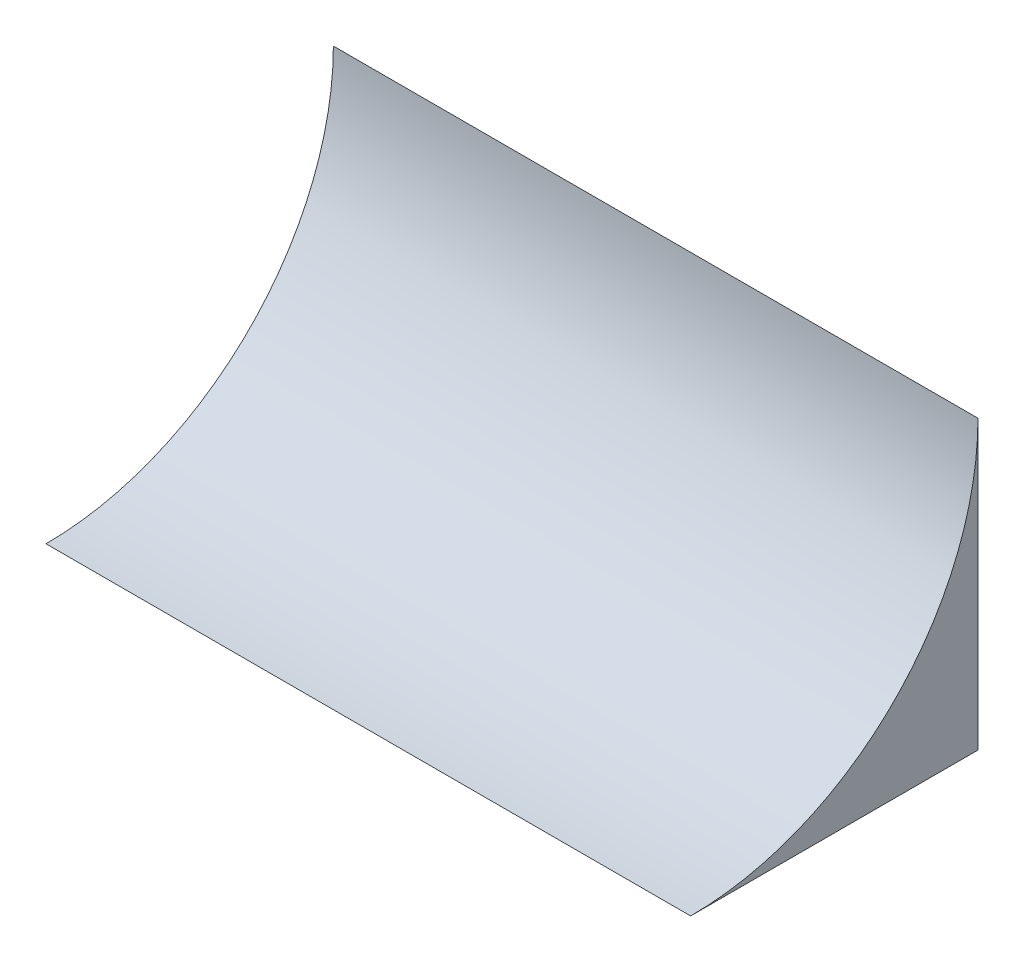
ISO-10303-21;
HEADER;
FILE_DESCRIPTION(('STEP AP214'),'2;1');
FILE_NAME('part.step','',(''),(''),'','','');
FILE_SCHEMA(('AUTOMOTIVE_DESIGN { 1 0 10303 214 1 1 1 1 }'));
ENDSEC;
DATA;
#1=APPLICATION_CONTEXT('core data for automotive mechanical design processes');
#2=APPLICATION_PROTOCOL_DEFINITION('international standard','automotive_design',2000,#1);
#3=PRODUCT_CONTEXT('',#1,'mechanical');
#4=PRODUCT('Part','Part','',(#3));
#5=PRODUCT_RELATED_PRODUCT_CATEGORY('part','',(#4));
#6=PRODUCT_DEFINITION_FORMATION('','',#4);
#7=PRODUCT_DEFINITION_CONTEXT('part definition',#1,'design');
#8=PRODUCT_DEFINITION('design','',#6,#7);
#9=PRODUCT_DEFINITION_SHAPE('','',#8);
#10=(LENGTH_UNIT() NAMED_UNIT(*) SI_UNIT(.MILLI.,.METRE.));
#11=(NAMED_UNIT(*) PLANE_ANGLE_UNIT() SI_UNIT($,.RADIAN.));
#12=(NAMED_UNIT(*) SI_UNIT($,.STERADIAN.) SOLID_ANGLE_UNIT());
#13=UNCERTAINTY_MEASURE_WITH_UNIT(LENGTH_MEASURE(1.E-05),#10,'distance_accuracy_value','');
#14=(GEOMETRIC_REPRESENTATION_CONTEXT(3) GLOBAL_UNCERTAINTY_ASSIGNED_CONTEXT((#13)) GLOBAL_UNIT_ASSIGNED_CONTEXT((#10,
#11,#12)) REPRESENTATION_CONTEXT('',''));
#15=CARTESIAN_POINT('',(0.,0.,0.));
#16=DIRECTION('',(0.,0.,1.));
#17=DIRECTION('',(1.,0.,0.));
#18=AXIS2_PLACEMENT_3D('',#15,#16,#17);
#19=CARTESIAN_POINT('',(100.,-22.29,-22.29));
#20=DIRECTION('',(0.,0.,1.));
#21=DIRECTION('',(1.,0.,0.));
#22=AXIS2_PLACEMENT_3D('',#19,#20,#21);
#23=PLANE('',#22);
#24=DIRECTION('',(0.,1.,0.));
#25=VECTOR('',#24,1.);
#26=CARTESIAN_POINT('',(0.,-22.29,-22.29));
#27=LINE('',#26,#25);
#28=CARTESIAN_POINT('',(0.,-22.29,-22.29));
#29=VERTEX_POINT('',#28);
#30=CARTESIAN_POINT('',(0.,22.29,-22.29));
#31=VERTEX_POINT('',#30);
#32=EDGE_CURVE('E79',#29,#31,#27,.T.);
#33=ORIENTED_EDGE('',*,*,#32,.T.);
#34=DIRECTION('',(-1.,0.,0.));
#35=VECTOR('',#34,1.);
#36=CARTESIAN_POINT('',(100.,22.29,-22.29));
#37=LINE('',#36,#35);
#38=CARTESIAN_POINT('',(100.,22.29,-22.29));
#39=VERTEX_POINT('',#38);
#40=EDGE_CURVE('E41',#39,#31,#37,.T.);
#41=ORIENTED_EDGE('',*,*,#40,.F.);
#42=DIRECTION('',(0.,1.,0.));
#43=VECTOR('',#42,1.);
#44=CARTESIAN_POINT('',(100.,-22.29,-22.29));
#45=LINE('',#44,#43);
#46=CARTESIAN_POINT('',(100.,-22.29,-22.29));
#47=VERTEX_POINT('',#46);
#48=EDGE_CURVE('E80',#47,#39,#45,.T.);
#49=ORIENTED_EDGE('',*,*,#48,.F.);
#50=DIRECTION('',(-1.,0.,0.));
#51=VECTOR('',#50,1.);
#52=CARTESIAN_POINT('',(100.,-22.29,-22.29));
#53=LINE('',#52,#51);
#54=EDGE_CURVE('E76',#47,#29,#53,.T.);
#55=ORIENTED_EDGE('',*,*,#54,.T.);
#56=EDGE_LOOP('',(#33,#41,#49,#55));
#57=FACE_BOUND('',#56,.T.);
#58=ADVANCED_FACE('F33',(#57),#23,.F.);
#59=CARTESIAN_POINT('',(100.,-22.29,22.29));
#60=DIRECTION('',(0.,1.,0.));
#61=DIRECTION('',(0.,0.,1.));
#62=AXIS2_PLACEMENT_3D('',#59,#60,#61);
#63=PLANE('',#62);
#64=DIRECTION('',(0.,0.,-1.));
#65=VECTOR('',#64,1.);
#66=CARTESIAN_POINT('',(0.,-22.29,22.29));
#67=LINE('',#66,#65);
#68=CARTESIAN_POINT('',(0.,-22.29,22.29));
#69=VERTEX_POINT('',#68);
#70=EDGE_CURVE('E74',#69,#29,#67,.T.);
#71=ORIENTED_EDGE('',*,*,#70,.T.);
#72=ORIENTED_EDGE('',*,*,#54,.F.);
#73=DIRECTION('',(0.,0.,-1.));
#74=VECTOR('',#73,1.);
#75=CARTESIAN_POINT('',(100.,-22.29,22.29));
#76=LINE('',#75,#74);
#77=CARTESIAN_POINT('',(100.,-22.29,22.29));
#78=VERTEX_POINT('',#77);
#79=EDGE_CURVE('E48',#78,#47,#76,.T.);
#80=ORIENTED_EDGE('',*,*,#79,.F.);
#81=DIRECTION('',(-1.,0.,0.));
#82=VECTOR('',#81,1.);
#83=CARTESIAN_POINT('',(100.,-22.29,22.29));
#84=LINE('',#83,#82);
#85=EDGE_CURVE('E63',#78,#69,#84,.T.);
#86=ORIENTED_EDGE('',*,*,#85,.T.);
#87=EDGE_LOOP('',(#71,#72,#80,#86));
#88=FACE_BOUND('',#87,.T.);
#89=ADVANCED_FACE('F73',(#88),#63,.F.);
#90=CARTESIAN_POINT('',(100.,0.,0.));
#91=DIRECTION('',(-1.,0.,0.));
#92=DIRECTION('',(0.,0.,1.));
#93=AXIS2_PLACEMENT_3D('',#90,#91,#92);
#94=PLANE('',#93);
#95=ORIENTED_EDGE('',*,*,#48,.T.);
#96=CARTESIAN_POINT('',(100.,22.29,22.29));
#97=DIRECTION('',(1.,0.,0.));
#98=DIRECTION('',(0.,0.,-1.));
#99=AXIS2_PLACEMENT_3D('',#96,#97,#98);
#100=CIRCLE('',#99,44.58);
#101=EDGE_CURVE('E65',#78,#39,#100,.T.);
#102=ORIENTED_EDGE('',*,*,#101,.F.);
#103=ORIENTED_EDGE('',*,*,#79,.T.);
#104=EDGE_LOOP('',(#95,#102,#103));
#105=FACE_BOUND('',#104,.T.);
#106=ADVANCED_FACE('F89',(#105),#94,.F.);
#107=CARTESIAN_POINT('',(0.,0.,0.));
#108=DIRECTION('',(-1.,0.,0.));
#109=DIRECTION('',(0.,0.,1.));
#110=AXIS2_PLACEMENT_3D('',#107,#108,#109);
#111=PLANE('',#110);
#112=CARTESIAN_POINT('',(0.,22.29,22.29));
#113=DIRECTION('',(-1.,0.,0.));
#114=DIRECTION('',(0.,0.,1.));
#115=AXIS2_PLACEMENT_3D('',#112,#113,#114);
#116=CIRCLE('',#115,44.58);
#117=EDGE_CURVE('E11',#31,#69,#116,.T.);
#118=ORIENTED_EDGE('',*,*,#117,.F.);
#119=ORIENTED_EDGE('',*,*,#32,.F.);
#120=ORIENTED_EDGE('',*,*,#70,.F.);
#121=EDGE_LOOP('',(#118,#119,#120));
#122=FACE_BOUND('',#121,.T.);
#123=ADVANCED_FACE('F78',(#122),#111,.T.);
#124=CARTESIAN_POINT('',(0.,22.29,22.29));
#125=DIRECTION('',(1.,0.,0.));
#126=DIRECTION('',(0.,0.,-1.));
#127=AXIS2_PLACEMENT_3D('',#124,#125,#126);
#128=CYLINDRICAL_SURFACE('',#127,44.58);
#129=ORIENTED_EDGE('',*,*,#117,.T.);
#130=ORIENTED_EDGE('',*,*,#85,.F.);
#131=ORIENTED_EDGE('',*,*,#101,.T.);
#132=ORIENTED_EDGE('',*,*,#40,.T.);
#133=EDGE_LOOP('',(#129,#130,#131,#132));
#134=FACE_BOUND('',#133,.T.);
#135=ADVANCED_FACE('F67',(#134),#128,.F.);
#136=CLOSED_SHELL('',(#58,#89,#106,#123,#135));
#137=MANIFOLD_SOLID_BREP('B2',#136);
#138=ADVANCED_BREP_SHAPE_REPRESENTATION('',(#18,#137),#14);
#139=SHAPE_DEFINITION_REPRESENTATION(#9,#138);
ENDSEC;
END-ISO-10303-21;
